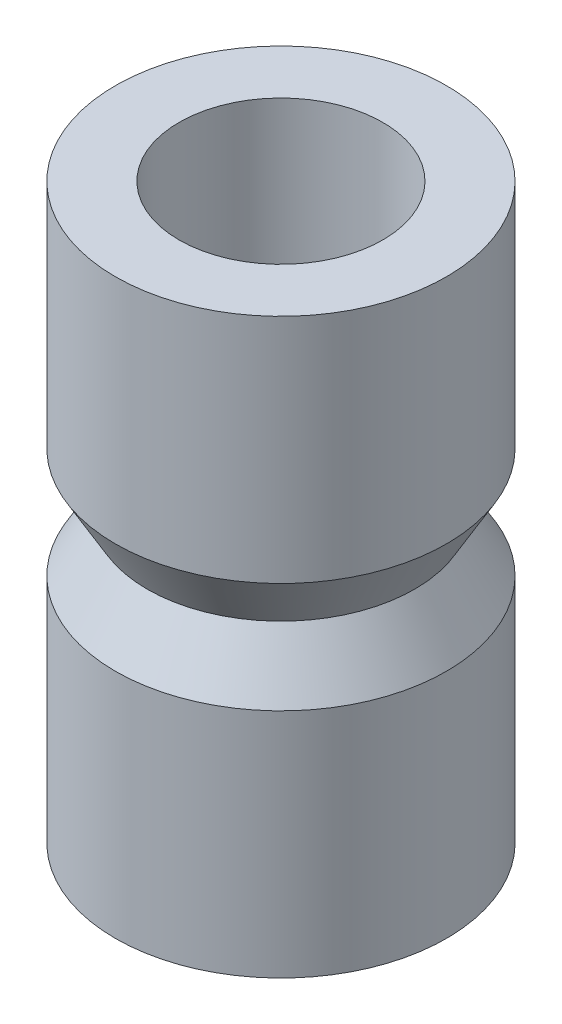
ISO-10303-21;
HEADER;
FILE_DESCRIPTION(('STEP AP214'),'2;1');
FILE_NAME('part.step','',(''),(''),'','','');
FILE_SCHEMA(('AUTOMOTIVE_DESIGN { 1 0 10303 214 1 1 1 1 }'));
ENDSEC;
DATA;
#1=APPLICATION_CONTEXT('core data for automotive mechanical design processes');
#2=APPLICATION_PROTOCOL_DEFINITION('international standard','automotive_design',2000,#1);
#3=PRODUCT_CONTEXT('',#1,'mechanical');
#4=PRODUCT('Part','Part','',(#3));
#5=PRODUCT_RELATED_PRODUCT_CATEGORY('part','',(#4));
#6=PRODUCT_DEFINITION_FORMATION('','',#4);
#7=PRODUCT_DEFINITION_CONTEXT('part definition',#1,'design');
#8=PRODUCT_DEFINITION('design','',#6,#7);
#9=PRODUCT_DEFINITION_SHAPE('','',#8);
#10=(LENGTH_UNIT() NAMED_UNIT(*) SI_UNIT(.MILLI.,.METRE.));
#11=(NAMED_UNIT(*) PLANE_ANGLE_UNIT() SI_UNIT($,.RADIAN.));
#12=(NAMED_UNIT(*) SI_UNIT($,.STERADIAN.) SOLID_ANGLE_UNIT());
#13=UNCERTAINTY_MEASURE_WITH_UNIT(LENGTH_MEASURE(1.E-05),#10,'distance_accuracy_value','');
#14=(GEOMETRIC_REPRESENTATION_CONTEXT(3) GLOBAL_UNCERTAINTY_ASSIGNED_CONTEXT((#13)) GLOBAL_UNIT_ASSIGNED_CONTEXT((#10,
#11,#12)) REPRESENTATION_CONTEXT('',''));
#15=CARTESIAN_POINT('',(0.,0.,0.));
#16=DIRECTION('',(0.,0.,1.));
#17=DIRECTION('',(1.,0.,0.));
#18=AXIS2_PLACEMENT_3D('',#15,#16,#17);
#19=CARTESIAN_POINT('',(0.,9.,0.));
#20=DIRECTION('',(0.,-1.,0.));
#21=DIRECTION('',(0.,0.,-1.));
#22=AXIS2_PLACEMENT_3D('',#19,#20,#21);
#23=CYLINDRICAL_SURFACE('',#22,2.6);
#24=CARTESIAN_POINT('',(0.,5.36602540378445,0.));
#25=DIRECTION('',(0.,1.,0.));
#26=DIRECTION('',(0.,0.,1.));
#27=AXIS2_PLACEMENT_3D('',#24,#25,#26);
#28=CIRCLE('',#27,2.6);
#29=CARTESIAN_POINT('',(0.,5.36602540378445,2.6));
#30=VERTEX_POINT('',#29);
#31=EDGE_CURVE('E49',#30,#30,#28,.T.);
#32=ORIENTED_EDGE('',*,*,#31,.T.);
#33=EDGE_LOOP('',(#32));
#34=FACE_BOUND('',#33,.T.);
#35=CARTESIAN_POINT('',(0.,9.,0.));
#36=DIRECTION('',(0.,1.,0.));
#37=DIRECTION('',(0.,0.,1.));
#38=AXIS2_PLACEMENT_3D('',#35,#36,#37);
#39=CIRCLE('',#38,2.6);
#40=CARTESIAN_POINT('',(0.,9.,2.6));
#41=VERTEX_POINT('',#40);
#42=EDGE_CURVE('E10',#41,#41,#39,.T.);
#43=ORIENTED_EDGE('',*,*,#42,.F.);
#44=EDGE_LOOP('',(#43));
#45=FACE_BOUND('',#44,.T.);
#46=ADVANCED_FACE('F33',(#34,#45),#23,.T.);
#47=CARTESIAN_POINT('',(0.,9.,0.));
#48=DIRECTION('',(0.,1.,0.));
#49=DIRECTION('',(0.,0.,1.));
#50=AXIS2_PLACEMENT_3D('',#47,#48,#49);
#51=PLANE('',#50);
#52=ORIENTED_EDGE('',*,*,#42,.T.);
#53=EDGE_LOOP('',(#52));
#54=FACE_BOUND('',#53,.T.);
#55=CARTESIAN_POINT('',(0.,9.,0.));
#56=DIRECTION('',(0.,1.,0.));
#57=DIRECTION('',(0.,0.,1.));
#58=AXIS2_PLACEMENT_3D('',#55,#56,#57);
#59=CIRCLE('',#58,1.6);
#60=CARTESIAN_POINT('',(0.,9.,1.6));
#61=VERTEX_POINT('',#60);
#62=EDGE_CURVE('E44',#61,#61,#59,.T.);
#63=ORIENTED_EDGE('',*,*,#62,.F.);
#64=EDGE_LOOP('',(#63));
#65=FACE_BOUND('',#64,.T.);
#66=ADVANCED_FACE('F71',(#54,#65),#51,.T.);
#67=CARTESIAN_POINT('',(0.,0.,0.));
#68=DIRECTION('',(0.,1.,0.));
#69=DIRECTION('',(0.,0.,1.));
#70=AXIS2_PLACEMENT_3D('',#67,#68,#69);
#71=PLANE('',#70);
#72=CARTESIAN_POINT('',(0.,0.,0.));
#73=DIRECTION('',(0.,1.,0.));
#74=DIRECTION('',(0.,0.,1.));
#75=AXIS2_PLACEMENT_3D('',#72,#73,#74);
#76=CIRCLE('',#75,2.6);
#77=CARTESIAN_POINT('',(0.,0.,2.6));
#78=VERTEX_POINT('',#77);
#79=EDGE_CURVE('E37',#78,#78,#76,.T.);
#80=ORIENTED_EDGE('',*,*,#79,.F.);
#81=EDGE_LOOP('',(#80));
#82=FACE_BOUND('',#81,.T.);
#83=CARTESIAN_POINT('',(0.,0.,0.));
#84=DIRECTION('',(0.,1.,0.));
#85=DIRECTION('',(0.,0.,1.));
#86=AXIS2_PLACEMENT_3D('',#83,#84,#85);
#87=CIRCLE('',#86,1.6);
#88=CARTESIAN_POINT('',(0.,0.,1.6));
#89=VERTEX_POINT('',#88);
#90=EDGE_CURVE('E46',#89,#89,#87,.T.);
#91=ORIENTED_EDGE('',*,*,#90,.T.);
#92=EDGE_LOOP('',(#91));
#93=FACE_BOUND('',#92,.T.);
#94=ADVANCED_FACE('F66',(#82,#93),#71,.F.);
#95=CARTESIAN_POINT('',(0.,3.63397459621555,0.));
#96=DIRECTION('',(0.,1.,0.));
#97=DIRECTION('',(0.,0.,1.));
#98=AXIS2_PLACEMENT_3D('',#95,#96,#97);
#99=CIRCLE('',#98,2.6);
#100=CARTESIAN_POINT('',(0.,3.63397459621555,2.6));
#101=VERTEX_POINT('',#100);
#102=EDGE_CURVE('E57',#101,#101,#99,.T.);
#103=ORIENTED_EDGE('',*,*,#102,.F.);
#104=EDGE_LOOP('',(#103));
#105=FACE_BOUND('',#104,.T.);
#106=ORIENTED_EDGE('',*,*,#79,.T.);
#107=EDGE_LOOP('',(#106));
#108=FACE_BOUND('',#107,.T.);
#109=ADVANCED_FACE('F35',(#105,#108),#23,.T.);
#110=CARTESIAN_POINT('',(0.,9.,0.));
#111=DIRECTION('',(0.,-1.,0.));
#112=DIRECTION('',(0.,0.,-1.));
#113=AXIS2_PLACEMENT_3D('',#110,#111,#112);
#114=CYLINDRICAL_SURFACE('',#113,1.6);
#115=ORIENTED_EDGE('',*,*,#62,.T.);
#116=EDGE_LOOP('',(#115));
#117=FACE_BOUND('',#116,.T.);
#118=ORIENTED_EDGE('',*,*,#90,.F.);
#119=EDGE_LOOP('',(#118));
#120=FACE_BOUND('',#119,.T.);
#121=ADVANCED_FACE('F65',(#117,#120),#114,.F.);
#122=CARTESIAN_POINT('',(0.,4.5,0.));
#123=DIRECTION('',(0.,1.,0.));
#124=DIRECTION('',(0.,0.,1.));
#125=AXIS2_PLACEMENT_3D('',#122,#123,#124);
#126=CONICAL_SURFACE('',#125,2.1,0.523598775598293);
#127=ORIENTED_EDGE('',*,*,#31,.F.);
#128=EDGE_LOOP('',(#127));
#129=FACE_BOUND('',#128,.T.);
#130=CARTESIAN_POINT('',(0.,4.5,0.));
#131=DIRECTION('',(0.,1.,0.));
#132=DIRECTION('',(0.,0.,1.));
#133=AXIS2_PLACEMENT_3D('',#130,#131,#132);
#134=CIRCLE('',#133,2.1);
#135=CARTESIAN_POINT('',(0.,4.5,2.1));
#136=VERTEX_POINT('',#135);
#137=EDGE_CURVE('E54',#136,#136,#134,.T.);
#138=ORIENTED_EDGE('',*,*,#137,.T.);
#139=EDGE_LOOP('',(#138));
#140=FACE_BOUND('',#139,.T.);
#141=ADVANCED_FACE('F75',(#129,#140),#126,.T.);
#142=CARTESIAN_POINT('',(0.,3.63397459621555,0.));
#143=DIRECTION('',(0.,-1.,0.));
#144=DIRECTION('',(0.,0.,-1.));
#145=AXIS2_PLACEMENT_3D('',#142,#143,#144);
#146=CONICAL_SURFACE('',#145,2.6,0.523598775598293);
#147=ORIENTED_EDGE('',*,*,#137,.F.);
#148=EDGE_LOOP('',(#147));
#149=FACE_BOUND('',#148,.T.);
#150=ORIENTED_EDGE('',*,*,#102,.T.);
#151=EDGE_LOOP('',(#150));
#152=FACE_BOUND('',#151,.T.);
#153=ADVANCED_FACE('F61',(#149,#152),#146,.T.);
#154=CLOSED_SHELL('',(#46,#66,#94,#109,#121,#141,#153));
#155=MANIFOLD_SOLID_BREP('B2',#154);
#156=ADVANCED_BREP_SHAPE_REPRESENTATION('',(#18,#155),#14);
#157=SHAPE_DEFINITION_REPRESENTATION(#9,#156);
ENDSEC;
END-ISO-10303-21;
